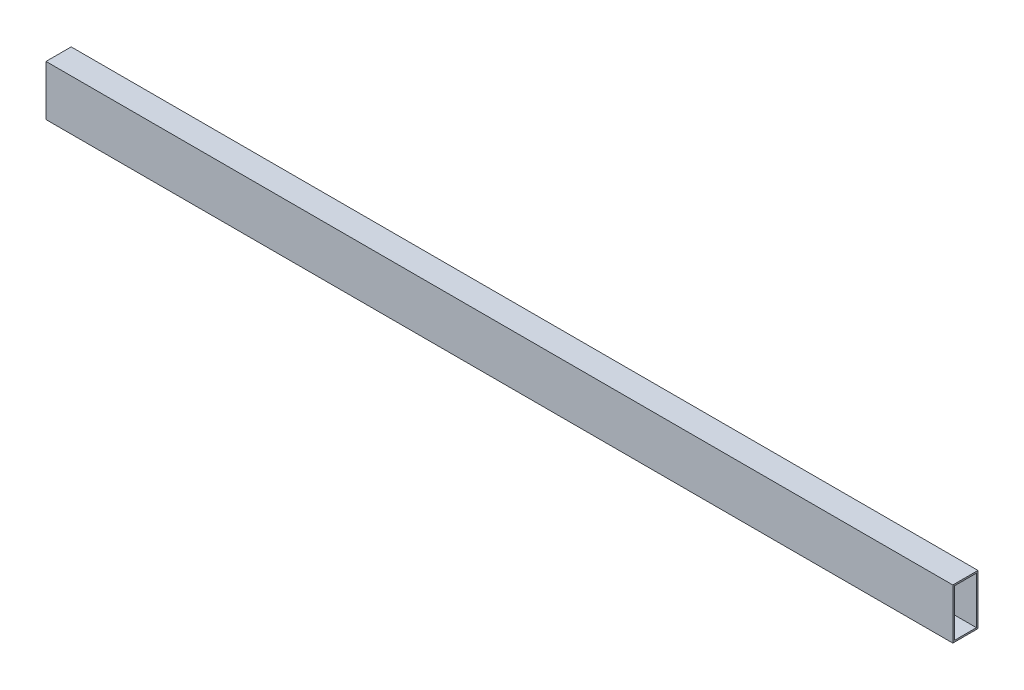
ISO-10303-21;
HEADER;
FILE_DESCRIPTION(('STEP AP214'),'2;1');
FILE_NAME('part.step','',(''),(''),'','','');
FILE_SCHEMA(('AUTOMOTIVE_DESIGN { 1 0 10303 214 1 1 1 1 }'));
ENDSEC;
DATA;
#1=APPLICATION_CONTEXT('core data for automotive mechanical design processes');
#2=APPLICATION_PROTOCOL_DEFINITION('international standard','automotive_design',2000,#1);
#3=PRODUCT_CONTEXT('',#1,'mechanical');
#4=PRODUCT('Part','Part','',(#3));
#5=PRODUCT_RELATED_PRODUCT_CATEGORY('part','',(#4));
#6=PRODUCT_DEFINITION_FORMATION('','',#4);
#7=PRODUCT_DEFINITION_CONTEXT('part definition',#1,'design');
#8=PRODUCT_DEFINITION('design','',#6,#7);
#9=PRODUCT_DEFINITION_SHAPE('','',#8);
#10=(LENGTH_UNIT() NAMED_UNIT(*) SI_UNIT(.MILLI.,.METRE.));
#11=(NAMED_UNIT(*) PLANE_ANGLE_UNIT() SI_UNIT($,.RADIAN.));
#12=(NAMED_UNIT(*) SI_UNIT($,.STERADIAN.) SOLID_ANGLE_UNIT());
#13=UNCERTAINTY_MEASURE_WITH_UNIT(LENGTH_MEASURE(1.E-05),#10,'distance_accuracy_value','');
#14=(GEOMETRIC_REPRESENTATION_CONTEXT(3) GLOBAL_UNCERTAINTY_ASSIGNED_CONTEXT((#13)) GLOBAL_UNIT_ASSIGNED_CONTEXT((#10,
#11,#12)) REPRESENTATION_CONTEXT('',''));
#15=CARTESIAN_POINT('',(0.,0.,0.));
#16=DIRECTION('',(0.,0.,1.));
#17=DIRECTION('',(1.,0.,0.));
#18=AXIS2_PLACEMENT_3D('',#15,#16,#17);
#19=CARTESIAN_POINT('',(457.2,0.,0.));
#20=DIRECTION('',(-1.,0.,0.));
#21=DIRECTION('',(0.,0.,1.));
#22=AXIS2_PLACEMENT_3D('',#19,#20,#21);
#23=PLANE('',#22);
#24=DIRECTION('',(0.,1.,0.));
#25=VECTOR('',#24,1.);
#26=CARTESIAN_POINT('',(457.2,-25.4,-14.6230032064473));
#27=LINE('',#26,#25);
#28=CARTESIAN_POINT('',(457.2,-25.4,-14.6230032064473));
#29=VERTEX_POINT('',#28);
#30=CARTESIAN_POINT('',(457.2,25.4,-14.6230032064473));
#31=VERTEX_POINT('',#30);
#32=EDGE_CURVE('E153',#29,#31,#27,.T.);
#33=ORIENTED_EDGE('',*,*,#32,.T.);
#34=DIRECTION('',(0.,0.,1.));
#35=VECTOR('',#34,1.);
#36=CARTESIAN_POINT('',(457.2,25.4,10.7769967935527));
#37=LINE('',#36,#35);
#38=CARTESIAN_POINT('',(457.2,25.4,10.7769967935527));
#39=VERTEX_POINT('',#38);
#40=EDGE_CURVE('E157',#31,#39,#37,.T.);
#41=ORIENTED_EDGE('',*,*,#40,.T.);
#42=DIRECTION('',(0.,-1.,0.));
#43=VECTOR('',#42,1.);
#44=CARTESIAN_POINT('',(457.2,-25.4,10.7769967935527));
#45=LINE('',#44,#43);
#46=CARTESIAN_POINT('',(457.2,-25.4,10.7769967935527));
#47=VERTEX_POINT('',#46);
#48=EDGE_CURVE('E161',#39,#47,#45,.T.);
#49=ORIENTED_EDGE('',*,*,#48,.T.);
#50=DIRECTION('',(0.,0.,-1.));
#51=VECTOR('',#50,1.);
#52=CARTESIAN_POINT('',(457.2,-25.4,10.7769967935527));
#53=LINE('',#52,#51);
#54=EDGE_CURVE('E164',#47,#29,#53,.T.);
#55=ORIENTED_EDGE('',*,*,#54,.T.);
#56=EDGE_LOOP('',(#33,#41,#49,#55));
#57=FACE_BOUND('',#56,.T.);
#58=DIRECTION('',(0.,0.,-1.));
#59=VECTOR('',#58,1.);
#60=CARTESIAN_POINT('',(457.2,-23.8125,9.18949679355275));
#61=LINE('',#60,#59);
#62=CARTESIAN_POINT('',(457.2,-23.8125,9.18949679355275));
#63=VERTEX_POINT('',#62);
#64=CARTESIAN_POINT('',(457.2,-23.8125,-13.0355032064473));
#65=VERTEX_POINT('',#64);
#66=EDGE_CURVE('E105',#63,#65,#61,.T.);
#67=ORIENTED_EDGE('',*,*,#66,.F.);
#68=DIRECTION('',(0.,-1.,0.));
#69=VECTOR('',#68,1.);
#70=CARTESIAN_POINT('',(457.2,-23.8125,9.18949679355275));
#71=LINE('',#70,#69);
#72=CARTESIAN_POINT('',(457.2,23.8125,9.18949679355275));
#73=VERTEX_POINT('',#72);
#74=EDGE_CURVE('E131',#73,#63,#71,.T.);
#75=ORIENTED_EDGE('',*,*,#74,.F.);
#76=DIRECTION('',(0.,0.,1.));
#77=VECTOR('',#76,1.);
#78=CARTESIAN_POINT('',(457.2,23.8125,9.18949679355275));
#79=LINE('',#78,#77);
#80=CARTESIAN_POINT('',(457.2,23.8125,-13.0355032064473));
#81=VERTEX_POINT('',#80);
#82=EDGE_CURVE('E127',#81,#73,#79,.T.);
#83=ORIENTED_EDGE('',*,*,#82,.F.);
#84=DIRECTION('',(0.,1.,0.));
#85=VECTOR('',#84,1.);
#86=CARTESIAN_POINT('',(457.2,-23.8125,-13.0355032064473));
#87=LINE('',#86,#85);
#88=EDGE_CURVE('E114',#65,#81,#87,.T.);
#89=ORIENTED_EDGE('',*,*,#88,.F.);
#90=EDGE_LOOP('',(#67,#75,#83,#89));
#91=FACE_BOUND('',#90,.T.);
#92=ADVANCED_FACE('F39',(#57,#91),#23,.F.);
#93=CARTESIAN_POINT('',(-457.2,0.,0.));
#94=DIRECTION('',(-1.,0.,0.));
#95=DIRECTION('',(0.,0.,1.));
#96=AXIS2_PLACEMENT_3D('',#93,#94,#95);
#97=PLANE('',#96);
#98=DIRECTION('',(0.,1.,0.));
#99=VECTOR('',#98,1.);
#100=CARTESIAN_POINT('',(-457.2,-25.4,-14.6230032064473));
#101=LINE('',#100,#99);
#102=CARTESIAN_POINT('',(-457.2,-25.4,-14.6230032064473));
#103=VERTEX_POINT('',#102);
#104=CARTESIAN_POINT('',(-457.2,25.4,-14.6230032064473));
#105=VERTEX_POINT('',#104);
#106=EDGE_CURVE('E123',#103,#105,#101,.T.);
#107=ORIENTED_EDGE('',*,*,#106,.F.);
#108=DIRECTION('',(0.,0.,-1.));
#109=VECTOR('',#108,1.);
#110=CARTESIAN_POINT('',(-457.2,-25.4,10.7769967935527));
#111=LINE('',#110,#109);
#112=CARTESIAN_POINT('',(-457.2,-25.4,10.7769967935527));
#113=VERTEX_POINT('',#112);
#114=EDGE_CURVE('E158',#113,#103,#111,.T.);
#115=ORIENTED_EDGE('',*,*,#114,.F.);
#116=DIRECTION('',(0.,-1.,0.));
#117=VECTOR('',#116,1.);
#118=CARTESIAN_POINT('',(-457.2,-25.4,10.7769967935527));
#119=LINE('',#118,#117);
#120=CARTESIAN_POINT('',(-457.2,25.4,10.7769967935527));
#121=VERTEX_POINT('',#120);
#122=EDGE_CURVE('E174',#121,#113,#119,.T.);
#123=ORIENTED_EDGE('',*,*,#122,.F.);
#124=DIRECTION('',(0.,0.,1.));
#125=VECTOR('',#124,1.);
#126=CARTESIAN_POINT('',(-457.2,25.4,10.7769967935527));
#127=LINE('',#126,#125);
#128=EDGE_CURVE('E171',#105,#121,#127,.T.);
#129=ORIENTED_EDGE('',*,*,#128,.F.);
#130=EDGE_LOOP('',(#107,#115,#123,#129));
#131=FACE_BOUND('',#130,.T.);
#132=DIRECTION('',(0.,-1.,0.));
#133=VECTOR('',#132,1.);
#134=CARTESIAN_POINT('',(-457.2,-23.8125,9.18949679355275));
#135=LINE('',#134,#133);
#136=CARTESIAN_POINT('',(-457.2,23.8125,9.18949679355275));
#137=VERTEX_POINT('',#136);
#138=CARTESIAN_POINT('',(-457.2,-23.8125,9.18949679355275));
#139=VERTEX_POINT('',#138);
#140=EDGE_CURVE('E115',#137,#139,#135,.T.);
#141=ORIENTED_EDGE('',*,*,#140,.T.);
#142=DIRECTION('',(0.,0.,-1.));
#143=VECTOR('',#142,1.);
#144=CARTESIAN_POINT('',(-457.2,-23.8125,9.18949679355275));
#145=LINE('',#144,#143);
#146=CARTESIAN_POINT('',(-457.2,-23.8125,-13.0355032064473));
#147=VERTEX_POINT('',#146);
#148=EDGE_CURVE('E63',#139,#147,#145,.T.);
#149=ORIENTED_EDGE('',*,*,#148,.T.);
#150=DIRECTION('',(0.,1.,0.));
#151=VECTOR('',#150,1.);
#152=CARTESIAN_POINT('',(-457.2,-23.8125,-13.0355032064473));
#153=LINE('',#152,#151);
#154=CARTESIAN_POINT('',(-457.2,23.8125,-13.0355032064473));
#155=VERTEX_POINT('',#154);
#156=EDGE_CURVE('E121',#147,#155,#153,.T.);
#157=ORIENTED_EDGE('',*,*,#156,.T.);
#158=DIRECTION('',(0.,0.,1.));
#159=VECTOR('',#158,1.);
#160=CARTESIAN_POINT('',(-457.2,23.8125,9.18949679355275));
#161=LINE('',#160,#159);
#162=EDGE_CURVE('E140',#155,#137,#161,.T.);
#163=ORIENTED_EDGE('',*,*,#162,.T.);
#164=EDGE_LOOP('',(#141,#149,#157,#163));
#165=FACE_BOUND('',#164,.T.);
#166=ADVANCED_FACE('F197',(#131,#165),#97,.T.);
#167=CARTESIAN_POINT('',(457.2,-25.4,-14.6230032064473));
#168=DIRECTION('',(0.,0.,1.));
#169=DIRECTION('',(1.,0.,0.));
#170=AXIS2_PLACEMENT_3D('',#167,#168,#169);
#171=PLANE('',#170);
#172=ORIENTED_EDGE('',*,*,#106,.T.);
#173=DIRECTION('',(-1.,0.,0.));
#174=VECTOR('',#173,1.);
#175=CARTESIAN_POINT('',(457.2,25.4,-14.6230032064473));
#176=LINE('',#175,#174);
#177=EDGE_CURVE('E11',#31,#105,#176,.T.);
#178=ORIENTED_EDGE('',*,*,#177,.F.);
#179=ORIENTED_EDGE('',*,*,#32,.F.);
#180=DIRECTION('',(-1.,0.,0.));
#181=VECTOR('',#180,1.);
#182=CARTESIAN_POINT('',(457.2,-25.4,-14.6230032064473));
#183=LINE('',#182,#181);
#184=EDGE_CURVE('E167',#29,#103,#183,.T.);
#185=ORIENTED_EDGE('',*,*,#184,.T.);
#186=EDGE_LOOP('',(#172,#178,#179,#185));
#187=FACE_BOUND('',#186,.T.);
#188=ADVANCED_FACE('F41',(#187),#171,.F.);
#189=CARTESIAN_POINT('',(457.2,25.4,10.7769967935527));
#190=DIRECTION('',(0.,-1.,0.));
#191=DIRECTION('',(0.,0.,-1.));
#192=AXIS2_PLACEMENT_3D('',#189,#190,#191);
#193=PLANE('',#192);
#194=ORIENTED_EDGE('',*,*,#128,.T.);
#195=DIRECTION('',(-1.,0.,0.));
#196=VECTOR('',#195,1.);
#197=CARTESIAN_POINT('',(457.2,25.4,10.7769967935527));
#198=LINE('',#197,#196);
#199=EDGE_CURVE('E48',#39,#121,#198,.T.);
#200=ORIENTED_EDGE('',*,*,#199,.F.);
#201=ORIENTED_EDGE('',*,*,#40,.F.);
#202=ORIENTED_EDGE('',*,*,#177,.T.);
#203=EDGE_LOOP('',(#194,#200,#201,#202));
#204=FACE_BOUND('',#203,.T.);
#205=ADVANCED_FACE('F207',(#204),#193,.F.);
#206=CARTESIAN_POINT('',(457.2,-25.4,10.7769967935527));
#207=DIRECTION('',(0.,0.,-1.));
#208=DIRECTION('',(-1.,0.,0.));
#209=AXIS2_PLACEMENT_3D('',#206,#207,#208);
#210=PLANE('',#209);
#211=ORIENTED_EDGE('',*,*,#122,.T.);
#212=DIRECTION('',(-1.,0.,0.));
#213=VECTOR('',#212,1.);
#214=CARTESIAN_POINT('',(457.2,-25.4,10.7769967935527));
#215=LINE('',#214,#213);
#216=EDGE_CURVE('E182',#47,#113,#215,.T.);
#217=ORIENTED_EDGE('',*,*,#216,.F.);
#218=ORIENTED_EDGE('',*,*,#48,.F.);
#219=ORIENTED_EDGE('',*,*,#199,.T.);
#220=EDGE_LOOP('',(#211,#217,#218,#219));
#221=FACE_BOUND('',#220,.T.);
#222=ADVANCED_FACE('F191',(#221),#210,.F.);
#223=CARTESIAN_POINT('',(457.2,-25.4,10.7769967935527));
#224=DIRECTION('',(0.,1.,0.));
#225=DIRECTION('',(0.,0.,1.));
#226=AXIS2_PLACEMENT_3D('',#223,#224,#225);
#227=PLANE('',#226);
#228=ORIENTED_EDGE('',*,*,#114,.T.);
#229=ORIENTED_EDGE('',*,*,#184,.F.);
#230=ORIENTED_EDGE('',*,*,#54,.F.);
#231=ORIENTED_EDGE('',*,*,#216,.T.);
#232=EDGE_LOOP('',(#228,#229,#230,#231));
#233=FACE_BOUND('',#232,.T.);
#234=ADVANCED_FACE('F201',(#233),#227,.F.);
#235=CARTESIAN_POINT('',(457.2,-23.8125,9.18949679355275));
#236=DIRECTION('',(0.,1.,0.));
#237=DIRECTION('',(0.,0.,1.));
#238=AXIS2_PLACEMENT_3D('',#235,#236,#237);
#239=PLANE('',#238);
#240=ORIENTED_EDGE('',*,*,#148,.F.);
#241=DIRECTION('',(-1.,0.,0.));
#242=VECTOR('',#241,1.);
#243=CARTESIAN_POINT('',(457.2,-23.8125,9.18949679355275));
#244=LINE('',#243,#242);
#245=EDGE_CURVE('E109',#63,#139,#244,.T.);
#246=ORIENTED_EDGE('',*,*,#245,.F.);
#247=ORIENTED_EDGE('',*,*,#66,.T.);
#248=DIRECTION('',(-1.,0.,0.));
#249=VECTOR('',#248,1.);
#250=CARTESIAN_POINT('',(457.2,-23.8125,-13.0355032064473));
#251=LINE('',#250,#249);
#252=EDGE_CURVE('E108',#65,#147,#251,.T.);
#253=ORIENTED_EDGE('',*,*,#252,.T.);
#254=EDGE_LOOP('',(#240,#246,#247,#253));
#255=FACE_BOUND('',#254,.T.);
#256=ADVANCED_FACE('F107',(#255),#239,.T.);
#257=CARTESIAN_POINT('',(457.2,-23.8125,-13.0355032064473));
#258=DIRECTION('',(0.,0.,1.));
#259=DIRECTION('',(0.,-1.,0.));
#260=AXIS2_PLACEMENT_3D('',#257,#258,#259);
#261=PLANE('',#260);
#262=ORIENTED_EDGE('',*,*,#156,.F.);
#263=ORIENTED_EDGE('',*,*,#252,.F.);
#264=ORIENTED_EDGE('',*,*,#88,.T.);
#265=DIRECTION('',(-1.,0.,0.));
#266=VECTOR('',#265,1.);
#267=CARTESIAN_POINT('',(457.2,23.8125,-13.0355032064473));
#268=LINE('',#267,#266);
#269=EDGE_CURVE('E124',#81,#155,#268,.T.);
#270=ORIENTED_EDGE('',*,*,#269,.T.);
#271=EDGE_LOOP('',(#262,#263,#264,#270));
#272=FACE_BOUND('',#271,.T.);
#273=ADVANCED_FACE('F118',(#272),#261,.T.);
#274=CARTESIAN_POINT('',(457.2,23.8125,9.18949679355275));
#275=DIRECTION('',(0.,-1.,0.));
#276=DIRECTION('',(0.,0.,-1.));
#277=AXIS2_PLACEMENT_3D('',#274,#275,#276);
#278=PLANE('',#277);
#279=ORIENTED_EDGE('',*,*,#162,.F.);
#280=ORIENTED_EDGE('',*,*,#269,.F.);
#281=ORIENTED_EDGE('',*,*,#82,.T.);
#282=DIRECTION('',(-1.,0.,0.));
#283=VECTOR('',#282,1.);
#284=CARTESIAN_POINT('',(457.2,23.8125,9.18949679355275));
#285=LINE('',#284,#283);
#286=EDGE_CURVE('E55',#73,#137,#285,.T.);
#287=ORIENTED_EDGE('',*,*,#286,.T.);
#288=EDGE_LOOP('',(#279,#280,#281,#287));
#289=FACE_BOUND('',#288,.T.);
#290=ADVANCED_FACE('F230',(#289),#278,.T.);
#291=CARTESIAN_POINT('',(457.2,-23.8125,9.18949679355275));
#292=DIRECTION('',(0.,0.,-1.));
#293=DIRECTION('',(-1.,0.,0.));
#294=AXIS2_PLACEMENT_3D('',#291,#292,#293);
#295=PLANE('',#294);
#296=ORIENTED_EDGE('',*,*,#140,.F.);
#297=ORIENTED_EDGE('',*,*,#286,.F.);
#298=ORIENTED_EDGE('',*,*,#74,.T.);
#299=ORIENTED_EDGE('',*,*,#245,.T.);
#300=EDGE_LOOP('',(#296,#297,#298,#299));
#301=FACE_BOUND('',#300,.T.);
#302=ADVANCED_FACE('F234',(#301),#295,.T.);
#303=CLOSED_SHELL('',(#92,#166,#188,#205,#222,#234,#256,#273,#290,#302));
#304=MANIFOLD_SOLID_BREP('B2',#303);
#305=ADVANCED_BREP_SHAPE_REPRESENTATION('',(#18,#304),#14);
#306=SHAPE_DEFINITION_REPRESENTATION(#9,#305);
ENDSEC;
END-ISO-10303-21;
